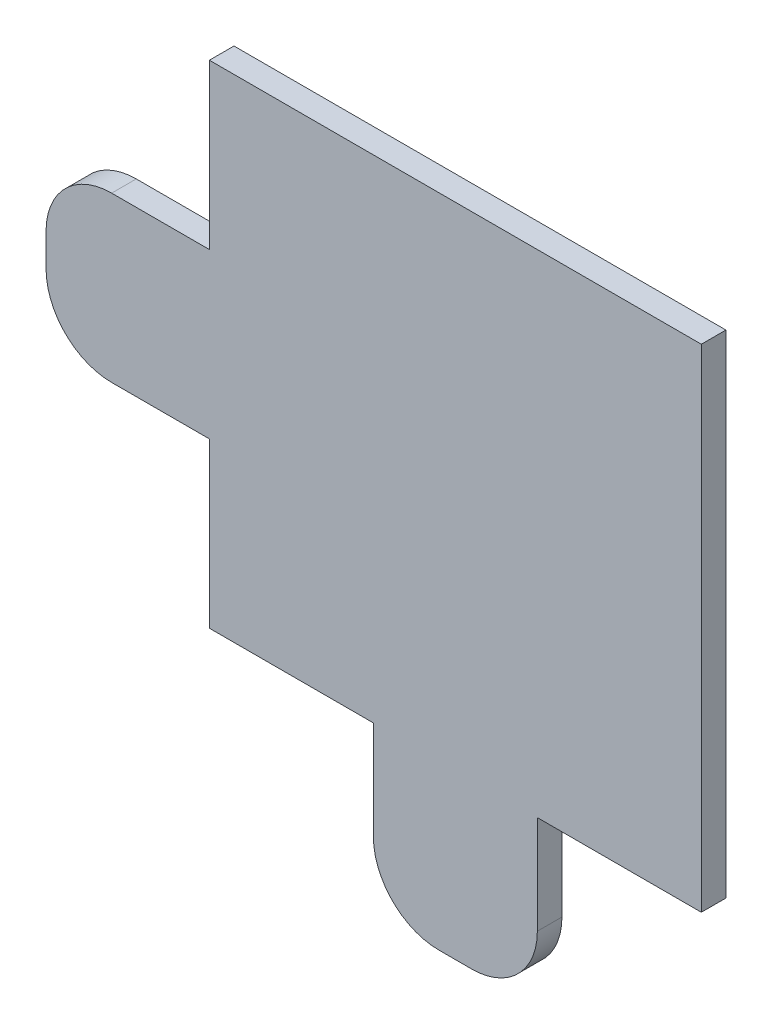
ISO-10303-21;
HEADER;
FILE_DESCRIPTION(('STEP AP214'),'2;1');
FILE_NAME('part.step','',(''),(''),'','','');
FILE_SCHEMA(('AUTOMOTIVE_DESIGN { 1 0 10303 214 1 1 1 1 }'));
ENDSEC;
DATA;
#1=APPLICATION_CONTEXT('core data for automotive mechanical design processes');
#2=APPLICATION_PROTOCOL_DEFINITION('international standard','automotive_design',2000,#1);
#3=PRODUCT_CONTEXT('',#1,'mechanical');
#4=PRODUCT('Part','Part','',(#3));
#5=PRODUCT_RELATED_PRODUCT_CATEGORY('part','',(#4));
#6=PRODUCT_DEFINITION_FORMATION('','',#4);
#7=PRODUCT_DEFINITION_CONTEXT('part definition',#1,'design');
#8=PRODUCT_DEFINITION('design','',#6,#7);
#9=PRODUCT_DEFINITION_SHAPE('','',#8);
#10=(LENGTH_UNIT() NAMED_UNIT(*) SI_UNIT(.MILLI.,.METRE.));
#11=(NAMED_UNIT(*) PLANE_ANGLE_UNIT() SI_UNIT($,.RADIAN.));
#12=(NAMED_UNIT(*) SI_UNIT($,.STERADIAN.) SOLID_ANGLE_UNIT());
#13=UNCERTAINTY_MEASURE_WITH_UNIT(LENGTH_MEASURE(1.E-05),#10,'distance_accuracy_value','');
#14=(GEOMETRIC_REPRESENTATION_CONTEXT(3) GLOBAL_UNCERTAINTY_ASSIGNED_CONTEXT((#13)) GLOBAL_UNIT_ASSIGNED_CONTEXT((#10,
#11,#12)) REPRESENTATION_CONTEXT('',''));
#15=CARTESIAN_POINT('',(0.,0.,0.));
#16=DIRECTION('',(0.,0.,1.));
#17=DIRECTION('',(1.,0.,0.));
#18=AXIS2_PLACEMENT_3D('',#15,#16,#17);
#19=CARTESIAN_POINT('',(0.1,-0.3,0.015));
#20=DIRECTION('',(0.,1.,0.));
#21=DIRECTION('',(0.,0.,1.));
#22=AXIS2_PLACEMENT_3D('',#19,#20,#21);
#23=PLANE('',#22);
#24=DIRECTION('',(1.,0.,0.));
#25=VECTOR('',#24,1.);
#26=CARTESIAN_POINT('',(0.1,-0.3,-0.015));
#27=LINE('',#26,#25);
#28=CARTESIAN_POINT('',(0.1,-0.3,-0.015));
#29=VERTEX_POINT('',#28);
#30=CARTESIAN_POINT('',(0.3,-0.3,-0.015));
#31=VERTEX_POINT('',#30);
#32=EDGE_CURVE('E177',#29,#31,#27,.T.);
#33=ORIENTED_EDGE('',*,*,#32,.T.);
#34=DIRECTION('',(0.,0.,-1.));
#35=VECTOR('',#34,1.);
#36=CARTESIAN_POINT('',(0.3,-0.3,0.015));
#37=LINE('',#36,#35);
#38=CARTESIAN_POINT('',(0.3,-0.3,0.015));
#39=VERTEX_POINT('',#38);
#40=EDGE_CURVE('E11',#39,#31,#37,.T.);
#41=ORIENTED_EDGE('',*,*,#40,.F.);
#42=DIRECTION('',(1.,0.,0.));
#43=VECTOR('',#42,1.);
#44=CARTESIAN_POINT('',(0.1,-0.3,0.015));
#45=LINE('',#44,#43);
#46=CARTESIAN_POINT('',(0.1,-0.3,0.015));
#47=VERTEX_POINT('',#46);
#48=EDGE_CURVE('E207',#47,#39,#45,.T.);
#49=ORIENTED_EDGE('',*,*,#48,.F.);
#50=DIRECTION('',(0.,0.,-1.));
#51=VECTOR('',#50,1.);
#52=CARTESIAN_POINT('',(0.1,-0.3,0.015));
#53=LINE('',#52,#51);
#54=EDGE_CURVE('E173',#47,#29,#53,.T.);
#55=ORIENTED_EDGE('',*,*,#54,.T.);
#56=EDGE_LOOP('',(#33,#41,#49,#55));
#57=FACE_BOUND('',#56,.T.);
#58=ADVANCED_FACE('F33',(#57),#23,.F.);
#59=CARTESIAN_POINT('',(0.3,0.3,0.015));
#60=DIRECTION('',(-1.,0.,0.));
#61=DIRECTION('',(0.,-1.,0.));
#62=AXIS2_PLACEMENT_3D('',#59,#60,#61);
#63=PLANE('',#62);
#64=DIRECTION('',(0.,1.,0.));
#65=VECTOR('',#64,1.);
#66=CARTESIAN_POINT('',(0.3,0.3,-0.015));
#67=LINE('',#66,#65);
#68=CARTESIAN_POINT('',(0.3,0.3,-0.015));
#69=VERTEX_POINT('',#68);
#70=EDGE_CURVE('E180',#31,#69,#67,.T.);
#71=ORIENTED_EDGE('',*,*,#70,.T.);
#72=DIRECTION('',(0.,0.,-1.));
#73=VECTOR('',#72,1.);
#74=CARTESIAN_POINT('',(0.3,0.3,0.015));
#75=LINE('',#74,#73);
#76=CARTESIAN_POINT('',(0.3,0.3,0.015));
#77=VERTEX_POINT('',#76);
#78=EDGE_CURVE('E41',#77,#69,#75,.T.);
#79=ORIENTED_EDGE('',*,*,#78,.F.);
#80=DIRECTION('',(0.,1.,0.));
#81=VECTOR('',#80,1.);
#82=CARTESIAN_POINT('',(0.3,0.3,0.015));
#83=LINE('',#82,#81);
#84=EDGE_CURVE('E116',#39,#77,#83,.T.);
#85=ORIENTED_EDGE('',*,*,#84,.F.);
#86=ORIENTED_EDGE('',*,*,#40,.T.);
#87=EDGE_LOOP('',(#71,#79,#85,#86));
#88=FACE_BOUND('',#87,.T.);
#89=ADVANCED_FACE('F305',(#88),#63,.F.);
#90=CARTESIAN_POINT('',(-0.3,0.3,0.015));
#91=DIRECTION('',(0.,-1.,0.));
#92=DIRECTION('',(0.,0.,-1.));
#93=AXIS2_PLACEMENT_3D('',#90,#91,#92);
#94=PLANE('',#93);
#95=DIRECTION('',(-1.,0.,0.));
#96=VECTOR('',#95,1.);
#97=CARTESIAN_POINT('',(-0.3,0.3,-0.015));
#98=LINE('',#97,#96);
#99=CARTESIAN_POINT('',(-0.3,0.3,-0.015));
#100=VERTEX_POINT('',#99);
#101=EDGE_CURVE('E182',#69,#100,#98,.T.);
#102=ORIENTED_EDGE('',*,*,#101,.T.);
#103=DIRECTION('',(0.,0.,-1.));
#104=VECTOR('',#103,1.);
#105=CARTESIAN_POINT('',(-0.3,0.3,0.015));
#106=LINE('',#105,#104);
#107=CARTESIAN_POINT('',(-0.3,0.3,0.015));
#108=VERTEX_POINT('',#107);
#109=EDGE_CURVE('E238',#108,#100,#106,.T.);
#110=ORIENTED_EDGE('',*,*,#109,.F.);
#111=DIRECTION('',(-1.,0.,0.));
#112=VECTOR('',#111,1.);
#113=CARTESIAN_POINT('',(-0.3,0.3,0.015));
#114=LINE('',#113,#112);
#115=EDGE_CURVE('E246',#77,#108,#114,.T.);
#116=ORIENTED_EDGE('',*,*,#115,.F.);
#117=ORIENTED_EDGE('',*,*,#78,.T.);
#118=EDGE_LOOP('',(#102,#110,#116,#117));
#119=FACE_BOUND('',#118,.T.);
#120=ADVANCED_FACE('F244',(#119),#94,.F.);
#121=CARTESIAN_POINT('',(-0.3,0.3,0.015));
#122=DIRECTION('',(1.,0.,0.));
#123=DIRECTION('',(0.,0.,-1.));
#124=AXIS2_PLACEMENT_3D('',#121,#122,#123);
#125=PLANE('',#124);
#126=DIRECTION('',(0.,-1.,0.));
#127=VECTOR('',#126,1.);
#128=CARTESIAN_POINT('',(-0.3,0.3,-0.015));
#129=LINE('',#128,#127);
#130=CARTESIAN_POINT('',(-0.3,0.1,-0.015));
#131=VERTEX_POINT('',#130);
#132=EDGE_CURVE('E184',#100,#131,#129,.T.);
#133=ORIENTED_EDGE('',*,*,#132,.T.);
#134=DIRECTION('',(0.,0.,-1.));
#135=VECTOR('',#134,1.);
#136=CARTESIAN_POINT('',(-0.3,0.1,0.015));
#137=LINE('',#136,#135);
#138=CARTESIAN_POINT('',(-0.3,0.1,0.015));
#139=VERTEX_POINT('',#138);
#140=EDGE_CURVE('E235',#139,#131,#137,.T.);
#141=ORIENTED_EDGE('',*,*,#140,.F.);
#142=DIRECTION('',(0.,-1.,0.));
#143=VECTOR('',#142,1.);
#144=CARTESIAN_POINT('',(-0.3,0.3,0.015));
#145=LINE('',#144,#143);
#146=EDGE_CURVE('E264',#108,#139,#145,.T.);
#147=ORIENTED_EDGE('',*,*,#146,.F.);
#148=ORIENTED_EDGE('',*,*,#109,.T.);
#149=EDGE_LOOP('',(#133,#141,#147,#148));
#150=FACE_BOUND('',#149,.T.);
#151=ADVANCED_FACE('F255',(#150),#125,.F.);
#152=CARTESIAN_POINT('',(-0.41919764948781,0.1,0.015));
#153=DIRECTION('',(0.,-1.,0.));
#154=DIRECTION('',(1.,0.,0.));
#155=AXIS2_PLACEMENT_3D('',#152,#153,#154);
#156=PLANE('',#155);
#157=DIRECTION('',(-1.,0.,0.));
#158=VECTOR('',#157,1.);
#159=CARTESIAN_POINT('',(-0.41919764948781,0.1,-0.015));
#160=LINE('',#159,#158);
#161=CARTESIAN_POINT('',(-0.41919764948781,0.1,-0.015));
#162=VERTEX_POINT('',#161);
#163=EDGE_CURVE('E186',#131,#162,#160,.T.);
#164=ORIENTED_EDGE('',*,*,#163,.T.);
#165=DIRECTION('',(0.,0.,-1.));
#166=VECTOR('',#165,1.);
#167=CARTESIAN_POINT('',(-0.41919764948781,0.1,0.015));
#168=LINE('',#167,#166);
#169=CARTESIAN_POINT('',(-0.41919764948781,0.1,0.015));
#170=VERTEX_POINT('',#169);
#171=EDGE_CURVE('E232',#170,#162,#168,.T.);
#172=ORIENTED_EDGE('',*,*,#171,.F.);
#173=DIRECTION('',(-1.,0.,0.));
#174=VECTOR('',#173,1.);
#175=CARTESIAN_POINT('',(-0.41919764948781,0.1,0.015));
#176=LINE('',#175,#174);
#177=EDGE_CURVE('E261',#139,#170,#176,.T.);
#178=ORIENTED_EDGE('',*,*,#177,.F.);
#179=ORIENTED_EDGE('',*,*,#140,.T.);
#180=EDGE_LOOP('',(#164,#172,#178,#179));
#181=FACE_BOUND('',#180,.T.);
#182=ADVANCED_FACE('F259',(#181),#156,.F.);
#183=CARTESIAN_POINT('',(-0.419197649487811,0.02,0.015));
#184=DIRECTION('',(0.,0.,-1.));
#185=DIRECTION('',(-1.,0.,0.));
#186=AXIS2_PLACEMENT_3D('',#183,#184,#185);
#187=CYLINDRICAL_SURFACE('',#186,0.08);
#188=CARTESIAN_POINT('',(-0.419197649487811,0.02,-0.015));
#189=DIRECTION('',(0.,0.,1.));
#190=DIRECTION('',(-1.,0.,0.));
#191=AXIS2_PLACEMENT_3D('',#188,#189,#190);
#192=CIRCLE('',#191,0.08);
#193=CARTESIAN_POINT('',(-0.499197649487811,0.0199999999999994,-0.015));
#194=VERTEX_POINT('',#193);
#195=EDGE_CURVE('E188',#162,#194,#192,.T.);
#196=ORIENTED_EDGE('',*,*,#195,.T.);
#197=DIRECTION('',(0.,0.,-1.));
#198=VECTOR('',#197,1.);
#199=CARTESIAN_POINT('',(-0.499197649487811,0.0199999999999994,0.015));
#200=LINE('',#199,#198);
#201=CARTESIAN_POINT('',(-0.499197649487811,0.0199999999999994,0.015));
#202=VERTEX_POINT('',#201);
#203=EDGE_CURVE('E229',#202,#194,#200,.T.);
#204=ORIENTED_EDGE('',*,*,#203,.F.);
#205=CARTESIAN_POINT('',(-0.419197649487811,0.02,0.015));
#206=DIRECTION('',(0.,0.,1.));
#207=DIRECTION('',(-1.,0.,0.));
#208=AXIS2_PLACEMENT_3D('',#205,#206,#207);
#209=CIRCLE('',#208,0.08);
#210=EDGE_CURVE('E263',#170,#202,#209,.T.);
#211=ORIENTED_EDGE('',*,*,#210,.F.);
#212=ORIENTED_EDGE('',*,*,#171,.T.);
#213=EDGE_LOOP('',(#196,#204,#211,#212));
#214=FACE_BOUND('',#213,.T.);
#215=ADVANCED_FACE('F318',(#214),#187,.T.);
#216=CARTESIAN_POINT('',(-0.499197649487811,0.0199999999999994,0.015));
#217=DIRECTION('',(1.,0.,0.));
#218=DIRECTION('',(0.,0.,-1.));
#219=AXIS2_PLACEMENT_3D('',#216,#217,#218);
#220=PLANE('',#219);
#221=DIRECTION('',(0.,-1.,0.));
#222=VECTOR('',#221,1.);
#223=CARTESIAN_POINT('',(-0.499197649487811,0.0199999999999994,-0.015));
#224=LINE('',#223,#222);
#225=CARTESIAN_POINT('',(-0.499197649487811,-0.0199999999999994,-0.015));
#226=VERTEX_POINT('',#225);
#227=EDGE_CURVE('E190',#194,#226,#224,.T.);
#228=ORIENTED_EDGE('',*,*,#227,.T.);
#229=DIRECTION('',(0.,0.,-1.));
#230=VECTOR('',#229,1.);
#231=CARTESIAN_POINT('',(-0.499197649487811,-0.0199999999999994,0.015));
#232=LINE('',#231,#230);
#233=CARTESIAN_POINT('',(-0.499197649487811,-0.0199999999999994,0.015));
#234=VERTEX_POINT('',#233);
#235=EDGE_CURVE('E226',#234,#226,#232,.T.);
#236=ORIENTED_EDGE('',*,*,#235,.F.);
#237=DIRECTION('',(0.,-1.,0.));
#238=VECTOR('',#237,1.);
#239=CARTESIAN_POINT('',(-0.499197649487811,0.0199999999999994,0.015));
#240=LINE('',#239,#238);
#241=EDGE_CURVE('E266',#202,#234,#240,.T.);
#242=ORIENTED_EDGE('',*,*,#241,.F.);
#243=ORIENTED_EDGE('',*,*,#203,.T.);
#244=EDGE_LOOP('',(#228,#236,#242,#243));
#245=FACE_BOUND('',#244,.T.);
#246=ADVANCED_FACE('F321',(#245),#220,.F.);
#247=CARTESIAN_POINT('',(-0.419197649487811,-0.02,0.015));
#248=DIRECTION('',(0.,0.,-1.));
#249=DIRECTION('',(-1.,0.,0.));
#250=AXIS2_PLACEMENT_3D('',#247,#248,#249);
#251=CYLINDRICAL_SURFACE('',#250,0.08);
#252=CARTESIAN_POINT('',(-0.419197649487811,-0.02,-0.015));
#253=DIRECTION('',(0.,0.,1.));
#254=DIRECTION('',(-1.,0.,0.));
#255=AXIS2_PLACEMENT_3D('',#252,#253,#254);
#256=CIRCLE('',#255,0.08);
#257=CARTESIAN_POINT('',(-0.41919764948781,-0.1,-0.015));
#258=VERTEX_POINT('',#257);
#259=EDGE_CURVE('E192',#226,#258,#256,.T.);
#260=ORIENTED_EDGE('',*,*,#259,.T.);
#261=DIRECTION('',(0.,0.,-1.));
#262=VECTOR('',#261,1.);
#263=CARTESIAN_POINT('',(-0.41919764948781,-0.1,0.015));
#264=LINE('',#263,#262);
#265=CARTESIAN_POINT('',(-0.41919764948781,-0.1,0.015));
#266=VERTEX_POINT('',#265);
#267=EDGE_CURVE('E223',#266,#258,#264,.T.);
#268=ORIENTED_EDGE('',*,*,#267,.F.);
#269=CARTESIAN_POINT('',(-0.419197649487811,-0.02,0.015));
#270=DIRECTION('',(0.,0.,1.));
#271=DIRECTION('',(-1.,0.,0.));
#272=AXIS2_PLACEMENT_3D('',#269,#270,#271);
#273=CIRCLE('',#272,0.08);
#274=EDGE_CURVE('E272',#234,#266,#273,.T.);
#275=ORIENTED_EDGE('',*,*,#274,.F.);
#276=ORIENTED_EDGE('',*,*,#235,.T.);
#277=EDGE_LOOP('',(#260,#268,#275,#276));
#278=FACE_BOUND('',#277,.T.);
#279=ADVANCED_FACE('F325',(#278),#251,.T.);
#280=CARTESIAN_POINT('',(-0.41919764948781,-0.1,0.015));
#281=DIRECTION('',(0.,1.,0.));
#282=DIRECTION('',(-1.,0.,0.));
#283=AXIS2_PLACEMENT_3D('',#280,#281,#282);
#284=PLANE('',#283);
#285=DIRECTION('',(1.,0.,0.));
#286=VECTOR('',#285,1.);
#287=CARTESIAN_POINT('',(-0.41919764948781,-0.1,-0.015));
#288=LINE('',#287,#286);
#289=CARTESIAN_POINT('',(-0.3,-0.1,-0.015));
#290=VERTEX_POINT('',#289);
#291=EDGE_CURVE('E194',#258,#290,#288,.T.);
#292=ORIENTED_EDGE('',*,*,#291,.T.);
#293=DIRECTION('',(0.,0.,-1.));
#294=VECTOR('',#293,1.);
#295=CARTESIAN_POINT('',(-0.3,-0.1,0.015));
#296=LINE('',#295,#294);
#297=CARTESIAN_POINT('',(-0.3,-0.1,0.015));
#298=VERTEX_POINT('',#297);
#299=EDGE_CURVE('E220',#298,#290,#296,.T.);
#300=ORIENTED_EDGE('',*,*,#299,.F.);
#301=DIRECTION('',(1.,0.,0.));
#302=VECTOR('',#301,1.);
#303=CARTESIAN_POINT('',(-0.41919764948781,-0.1,0.015));
#304=LINE('',#303,#302);
#305=EDGE_CURVE('E274',#266,#298,#304,.T.);
#306=ORIENTED_EDGE('',*,*,#305,.F.);
#307=ORIENTED_EDGE('',*,*,#267,.T.);
#308=EDGE_LOOP('',(#292,#300,#306,#307));
#309=FACE_BOUND('',#308,.T.);
#310=ADVANCED_FACE('F329',(#309),#284,.F.);
#311=CARTESIAN_POINT('',(-0.3,-0.1,0.015));
#312=DIRECTION('',(1.,0.,0.));
#313=DIRECTION('',(0.,1.,0.));
#314=AXIS2_PLACEMENT_3D('',#311,#312,#313);
#315=PLANE('',#314);
#316=DIRECTION('',(0.,-1.,0.));
#317=VECTOR('',#316,1.);
#318=CARTESIAN_POINT('',(-0.3,-0.1,-0.015));
#319=LINE('',#318,#317);
#320=CARTESIAN_POINT('',(-0.3,-0.3,-0.015));
#321=VERTEX_POINT('',#320);
#322=EDGE_CURVE('E196',#290,#321,#319,.T.);
#323=ORIENTED_EDGE('',*,*,#322,.T.);
#324=DIRECTION('',(0.,0.,-1.));
#325=VECTOR('',#324,1.);
#326=CARTESIAN_POINT('',(-0.3,-0.3,0.015));
#327=LINE('',#326,#325);
#328=CARTESIAN_POINT('',(-0.3,-0.3,0.015));
#329=VERTEX_POINT('',#328);
#330=EDGE_CURVE('E217',#329,#321,#327,.T.);
#331=ORIENTED_EDGE('',*,*,#330,.F.);
#332=DIRECTION('',(0.,-1.,0.));
#333=VECTOR('',#332,1.);
#334=CARTESIAN_POINT('',(-0.3,-0.1,0.015));
#335=LINE('',#334,#333);
#336=EDGE_CURVE('E276',#298,#329,#335,.T.);
#337=ORIENTED_EDGE('',*,*,#336,.F.);
#338=ORIENTED_EDGE('',*,*,#299,.T.);
#339=EDGE_LOOP('',(#323,#331,#337,#338));
#340=FACE_BOUND('',#339,.T.);
#341=ADVANCED_FACE('F333',(#340),#315,.F.);
#342=CARTESIAN_POINT('',(-0.3,-0.3,0.015));
#343=DIRECTION('',(0.,1.,0.));
#344=DIRECTION('',(0.,0.,1.));
#345=AXIS2_PLACEMENT_3D('',#342,#343,#344);
#346=PLANE('',#345);
#347=DIRECTION('',(1.,0.,0.));
#348=VECTOR('',#347,1.);
#349=CARTESIAN_POINT('',(-0.3,-0.3,-0.015));
#350=LINE('',#349,#348);
#351=CARTESIAN_POINT('',(-0.1,-0.3,-0.015));
#352=VERTEX_POINT('',#351);
#353=EDGE_CURVE('E198',#321,#352,#350,.T.);
#354=ORIENTED_EDGE('',*,*,#353,.T.);
#355=DIRECTION('',(0.,0.,-1.));
#356=VECTOR('',#355,1.);
#357=CARTESIAN_POINT('',(-0.1,-0.3,0.015));
#358=LINE('',#357,#356);
#359=CARTESIAN_POINT('',(-0.1,-0.3,0.015));
#360=VERTEX_POINT('',#359);
#361=EDGE_CURVE('E214',#360,#352,#358,.T.);
#362=ORIENTED_EDGE('',*,*,#361,.F.);
#363=DIRECTION('',(1.,0.,0.));
#364=VECTOR('',#363,1.);
#365=CARTESIAN_POINT('',(-0.3,-0.3,0.015));
#366=LINE('',#365,#364);
#367=EDGE_CURVE('E278',#329,#360,#366,.T.);
#368=ORIENTED_EDGE('',*,*,#367,.F.);
#369=ORIENTED_EDGE('',*,*,#330,.T.);
#370=EDGE_LOOP('',(#354,#362,#368,#369));
#371=FACE_BOUND('',#370,.T.);
#372=ADVANCED_FACE('F337',(#371),#346,.F.);
#373=CARTESIAN_POINT('',(-0.1,-0.419999999999999,0.015));
#374=DIRECTION('',(1.,0.,0.));
#375=DIRECTION('',(0.,1.,0.));
#376=AXIS2_PLACEMENT_3D('',#373,#374,#375);
#377=PLANE('',#376);
#378=DIRECTION('',(0.,-1.,0.));
#379=VECTOR('',#378,1.);
#380=CARTESIAN_POINT('',(-0.1,-0.419999999999999,-0.015));
#381=LINE('',#380,#379);
#382=CARTESIAN_POINT('',(-0.1,-0.419999999999999,-0.015));
#383=VERTEX_POINT('',#382);
#384=EDGE_CURVE('E200',#352,#383,#381,.T.);
#385=ORIENTED_EDGE('',*,*,#384,.T.);
#386=DIRECTION('',(0.,0.,-1.));
#387=VECTOR('',#386,1.);
#388=CARTESIAN_POINT('',(-0.1,-0.419999999999999,0.015));
#389=LINE('',#388,#387);
#390=CARTESIAN_POINT('',(-0.1,-0.419999999999999,0.015));
#391=VERTEX_POINT('',#390);
#392=EDGE_CURVE('E211',#391,#383,#389,.T.);
#393=ORIENTED_EDGE('',*,*,#392,.F.);
#394=DIRECTION('',(0.,-1.,0.));
#395=VECTOR('',#394,1.);
#396=CARTESIAN_POINT('',(-0.1,-0.419999999999999,0.015));
#397=LINE('',#396,#395);
#398=EDGE_CURVE('E280',#360,#391,#397,.T.);
#399=ORIENTED_EDGE('',*,*,#398,.F.);
#400=ORIENTED_EDGE('',*,*,#361,.T.);
#401=EDGE_LOOP('',(#385,#393,#399,#400));
#402=FACE_BOUND('',#401,.T.);
#403=ADVANCED_FACE('F286',(#402),#377,.F.);
#404=CARTESIAN_POINT('',(-0.02,-0.42,0.015));
#405=DIRECTION('',(0.,0.,-1.));
#406=DIRECTION('',(-1.,0.,0.));
#407=AXIS2_PLACEMENT_3D('',#404,#405,#406);
#408=CYLINDRICAL_SURFACE('',#407,0.08);
#409=CARTESIAN_POINT('',(-0.02,-0.42,-0.015));
#410=DIRECTION('',(0.,0.,1.));
#411=DIRECTION('',(-1.,0.,0.));
#412=AXIS2_PLACEMENT_3D('',#409,#410,#411);
#413=CIRCLE('',#412,0.08);
#414=CARTESIAN_POINT('',(-0.0199999999999994,-0.5,-0.015));
#415=VERTEX_POINT('',#414);
#416=EDGE_CURVE('E202',#383,#415,#413,.T.);
#417=ORIENTED_EDGE('',*,*,#416,.T.);
#418=DIRECTION('',(0.,0.,-1.));
#419=VECTOR('',#418,1.);
#420=CARTESIAN_POINT('',(-0.0199999999999994,-0.5,0.015));
#421=LINE('',#420,#419);
#422=CARTESIAN_POINT('',(-0.0199999999999994,-0.5,0.015));
#423=VERTEX_POINT('',#422);
#424=EDGE_CURVE('E168',#423,#415,#421,.T.);
#425=ORIENTED_EDGE('',*,*,#424,.F.);
#426=CARTESIAN_POINT('',(-0.02,-0.42,0.015));
#427=DIRECTION('',(0.,0.,1.));
#428=DIRECTION('',(-1.,0.,0.));
#429=AXIS2_PLACEMENT_3D('',#426,#427,#428);
#430=CIRCLE('',#429,0.08);
#431=EDGE_CURVE('E159',#391,#423,#430,.T.);
#432=ORIENTED_EDGE('',*,*,#431,.F.);
#433=ORIENTED_EDGE('',*,*,#392,.T.);
#434=EDGE_LOOP('',(#417,#425,#432,#433));
#435=FACE_BOUND('',#434,.T.);
#436=ADVANCED_FACE('F290',(#435),#408,.T.);
#437=CARTESIAN_POINT('',(-0.0199999999999994,-0.5,0.015));
#438=DIRECTION('',(0.,1.,0.));
#439=DIRECTION('',(0.,0.,1.));
#440=AXIS2_PLACEMENT_3D('',#437,#438,#439);
#441=PLANE('',#440);
#442=DIRECTION('',(1.,0.,0.));
#443=VECTOR('',#442,1.);
#444=CARTESIAN_POINT('',(-0.0199999999999994,-0.5,-0.015));
#445=LINE('',#444,#443);
#446=CARTESIAN_POINT('',(0.0199999999999994,-0.5,-0.015));
#447=VERTEX_POINT('',#446);
#448=EDGE_CURVE('E167',#415,#447,#445,.T.);
#449=ORIENTED_EDGE('',*,*,#448,.T.);
#450=DIRECTION('',(0.,0.,-1.));
#451=VECTOR('',#450,1.);
#452=CARTESIAN_POINT('',(0.0199999999999994,-0.5,0.015));
#453=LINE('',#452,#451);
#454=CARTESIAN_POINT('',(0.0199999999999994,-0.5,0.015));
#455=VERTEX_POINT('',#454);
#456=EDGE_CURVE('E164',#455,#447,#453,.T.);
#457=ORIENTED_EDGE('',*,*,#456,.F.);
#458=DIRECTION('',(1.,0.,0.));
#459=VECTOR('',#458,1.);
#460=CARTESIAN_POINT('',(-0.0199999999999994,-0.5,0.015));
#461=LINE('',#460,#459);
#462=EDGE_CURVE('E153',#423,#455,#461,.T.);
#463=ORIENTED_EDGE('',*,*,#462,.F.);
#464=ORIENTED_EDGE('',*,*,#424,.T.);
#465=EDGE_LOOP('',(#449,#457,#463,#464));
#466=FACE_BOUND('',#465,.T.);
#467=ADVANCED_FACE('F165',(#466),#441,.F.);
#468=CARTESIAN_POINT('',(0.02,-0.42,0.015));
#469=DIRECTION('',(0.,0.,-1.));
#470=DIRECTION('',(-1.,0.,0.));
#471=AXIS2_PLACEMENT_3D('',#468,#469,#470);
#472=CYLINDRICAL_SURFACE('',#471,0.08);
#473=CARTESIAN_POINT('',(0.02,-0.42,-0.015));
#474=DIRECTION('',(0.,0.,1.));
#475=DIRECTION('',(-1.,0.,0.));
#476=AXIS2_PLACEMENT_3D('',#473,#474,#475);
#477=CIRCLE('',#476,0.08);
#478=CARTESIAN_POINT('',(0.1,-0.419999999999999,-0.015));
#479=VERTEX_POINT('',#478);
#480=EDGE_CURVE('E102',#447,#479,#477,.T.);
#481=ORIENTED_EDGE('',*,*,#480,.T.);
#482=DIRECTION('',(0.,0.,-1.));
#483=VECTOR('',#482,1.);
#484=CARTESIAN_POINT('',(0.1,-0.419999999999999,0.015));
#485=LINE('',#484,#483);
#486=CARTESIAN_POINT('',(0.1,-0.419999999999999,0.015));
#487=VERTEX_POINT('',#486);
#488=EDGE_CURVE('E169',#487,#479,#485,.T.);
#489=ORIENTED_EDGE('',*,*,#488,.F.);
#490=CARTESIAN_POINT('',(0.02,-0.42,0.015));
#491=DIRECTION('',(0.,0.,1.));
#492=DIRECTION('',(-1.,0.,0.));
#493=AXIS2_PLACEMENT_3D('',#490,#491,#492);
#494=CIRCLE('',#493,0.08);
#495=EDGE_CURVE('E157',#455,#487,#494,.T.);
#496=ORIENTED_EDGE('',*,*,#495,.F.);
#497=ORIENTED_EDGE('',*,*,#456,.T.);
#498=EDGE_LOOP('',(#481,#489,#496,#497));
#499=FACE_BOUND('',#498,.T.);
#500=ADVANCED_FACE('F171',(#499),#472,.T.);
#501=CARTESIAN_POINT('',(0.1,-0.419999999999999,0.015));
#502=DIRECTION('',(-1.,0.,0.));
#503=DIRECTION('',(0.,-1.,0.));
#504=AXIS2_PLACEMENT_3D('',#501,#502,#503);
#505=PLANE('',#504);
#506=DIRECTION('',(0.,1.,0.));
#507=VECTOR('',#506,1.);
#508=CARTESIAN_POINT('',(0.1,-0.419999999999999,-0.015));
#509=LINE('',#508,#507);
#510=EDGE_CURVE('E108',#479,#29,#509,.T.);
#511=ORIENTED_EDGE('',*,*,#510,.T.);
#512=ORIENTED_EDGE('',*,*,#54,.F.);
#513=DIRECTION('',(0.,1.,0.));
#514=VECTOR('',#513,1.);
#515=CARTESIAN_POINT('',(0.1,-0.419999999999999,0.015));
#516=LINE('',#515,#514);
#517=EDGE_CURVE('E49',#487,#47,#516,.T.);
#518=ORIENTED_EDGE('',*,*,#517,.F.);
#519=ORIENTED_EDGE('',*,*,#488,.T.);
#520=EDGE_LOOP('',(#511,#512,#518,#519));
#521=FACE_BOUND('',#520,.T.);
#522=ADVANCED_FACE('F294',(#521),#505,.F.);
#523=CARTESIAN_POINT('',(-0.419197649487811,0.02,0.015));
#524=DIRECTION('',(0.,0.,-1.));
#525=DIRECTION('',(-1.,0.,0.));
#526=AXIS2_PLACEMENT_3D('',#523,#524,#525);
#527=PLANE('',#526);
#528=ORIENTED_EDGE('',*,*,#48,.T.);
#529=ORIENTED_EDGE('',*,*,#84,.T.);
#530=ORIENTED_EDGE('',*,*,#115,.T.);
#531=ORIENTED_EDGE('',*,*,#146,.T.);
#532=ORIENTED_EDGE('',*,*,#177,.T.);
#533=ORIENTED_EDGE('',*,*,#210,.T.);
#534=ORIENTED_EDGE('',*,*,#241,.T.);
#535=ORIENTED_EDGE('',*,*,#274,.T.);
#536=ORIENTED_EDGE('',*,*,#305,.T.);
#537=ORIENTED_EDGE('',*,*,#336,.T.);
#538=ORIENTED_EDGE('',*,*,#367,.T.);
#539=ORIENTED_EDGE('',*,*,#398,.T.);
#540=ORIENTED_EDGE('',*,*,#431,.T.);
#541=ORIENTED_EDGE('',*,*,#462,.T.);
#542=ORIENTED_EDGE('',*,*,#495,.T.);
#543=ORIENTED_EDGE('',*,*,#517,.T.);
#544=EDGE_LOOP('',(#528,#529,#530,#531,#532,#533,#534,#535,#536,#537,#538,#539,#540,#541,#542,#543));
#545=FACE_BOUND('',#544,.T.);
#546=ADVANCED_FACE('F155',(#545),#527,.F.);
#547=CARTESIAN_POINT('',(-0.419197649487811,0.02,-0.015));
#548=DIRECTION('',(0.,0.,-1.));
#549=DIRECTION('',(-1.,0.,0.));
#550=AXIS2_PLACEMENT_3D('',#547,#548,#549);
#551=PLANE('',#550);
#552=ORIENTED_EDGE('',*,*,#32,.F.);
#553=ORIENTED_EDGE('',*,*,#510,.F.);
#554=ORIENTED_EDGE('',*,*,#480,.F.);
#555=ORIENTED_EDGE('',*,*,#448,.F.);
#556=ORIENTED_EDGE('',*,*,#416,.F.);
#557=ORIENTED_EDGE('',*,*,#384,.F.);
#558=ORIENTED_EDGE('',*,*,#353,.F.);
#559=ORIENTED_EDGE('',*,*,#322,.F.);
#560=ORIENTED_EDGE('',*,*,#291,.F.);
#561=ORIENTED_EDGE('',*,*,#259,.F.);
#562=ORIENTED_EDGE('',*,*,#227,.F.);
#563=ORIENTED_EDGE('',*,*,#195,.F.);
#564=ORIENTED_EDGE('',*,*,#163,.F.);
#565=ORIENTED_EDGE('',*,*,#132,.F.);
#566=ORIENTED_EDGE('',*,*,#101,.F.);
#567=ORIENTED_EDGE('',*,*,#70,.F.);
#568=EDGE_LOOP('',(#552,#553,#554,#555,#556,#557,#558,#559,#560,#561,#562,#563,#564,#565,#566,#567));
#569=FACE_BOUND('',#568,.T.);
#570=ADVANCED_FACE('F250',(#569),#551,.T.);
#571=CLOSED_SHELL('',(#58,#89,#120,#151,#182,#215,#246,#279,#310,#341,#372,#403,#436,#467,#500,
#522,#546,#570));
#572=MANIFOLD_SOLID_BREP('B2',#571);
#573=ADVANCED_BREP_SHAPE_REPRESENTATION('',(#18,#572),#14);
#574=SHAPE_DEFINITION_REPRESENTATION(#9,#573);
ENDSEC;
END-ISO-10303-21;
